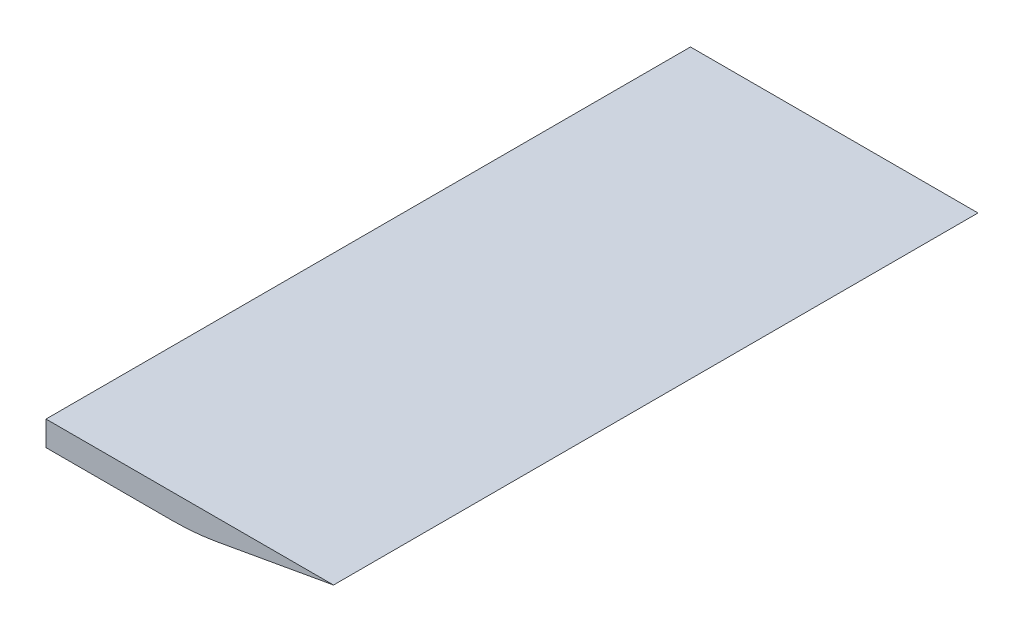
ISO-10303-21;
HEADER;
FILE_DESCRIPTION(('STEP AP214'),'2;1');
FILE_NAME('part.step','',(''),(''),'','','');
FILE_SCHEMA(('AUTOMOTIVE_DESIGN { 1 0 10303 214 1 1 1 1 }'));
ENDSEC;
DATA;
#1=APPLICATION_CONTEXT('core data for automotive mechanical design processes');
#2=APPLICATION_PROTOCOL_DEFINITION('international standard','automotive_design',2000,#1);
#3=PRODUCT_CONTEXT('',#1,'mechanical');
#4=PRODUCT('Part','Part','',(#3));
#5=PRODUCT_RELATED_PRODUCT_CATEGORY('part','',(#4));
#6=PRODUCT_DEFINITION_FORMATION('','',#4);
#7=PRODUCT_DEFINITION_CONTEXT('part definition',#1,'design');
#8=PRODUCT_DEFINITION('design','',#6,#7);
#9=PRODUCT_DEFINITION_SHAPE('','',#8);
#10=(LENGTH_UNIT() NAMED_UNIT(*) SI_UNIT(.MILLI.,.METRE.));
#11=(NAMED_UNIT(*) PLANE_ANGLE_UNIT() SI_UNIT($,.RADIAN.));
#12=(NAMED_UNIT(*) SI_UNIT($,.STERADIAN.) SOLID_ANGLE_UNIT());
#13=UNCERTAINTY_MEASURE_WITH_UNIT(LENGTH_MEASURE(1.E-05),#10,'distance_accuracy_value','');
#14=(GEOMETRIC_REPRESENTATION_CONTEXT(3) GLOBAL_UNCERTAINTY_ASSIGNED_CONTEXT((#13)) GLOBAL_UNIT_ASSIGNED_CONTEXT((#10,
#11,#12)) REPRESENTATION_CONTEXT('',''));
#15=CARTESIAN_POINT('',(0.,0.,0.));
#16=DIRECTION('',(0.,0.,1.));
#17=DIRECTION('',(1.,0.,0.));
#18=AXIS2_PLACEMENT_3D('',#15,#16,#17);
#19=CARTESIAN_POINT('',(0.,-5.,130.));
#20=DIRECTION('',(1.,0.,0.));
#21=DIRECTION('',(0.,0.,-1.));
#22=AXIS2_PLACEMENT_3D('',#19,#20,#21);
#23=PLANE('',#22);
#24=DIRECTION('',(0.,-1.,0.));
#25=VECTOR('',#24,1.);
#26=CARTESIAN_POINT('',(0.,-5.,0.));
#27=LINE('',#26,#25);
#28=CARTESIAN_POINT('',(0.,0.,0.));
#29=VERTEX_POINT('',#28);
#30=CARTESIAN_POINT('',(0.,-5.,0.));
#31=VERTEX_POINT('',#30);
#32=EDGE_CURVE('E103',#29,#31,#27,.T.);
#33=ORIENTED_EDGE('',*,*,#32,.T.);
#34=DIRECTION('',(0.,0.,-1.));
#35=VECTOR('',#34,1.);
#36=CARTESIAN_POINT('',(0.,-5.,130.));
#37=LINE('',#36,#35);
#38=CARTESIAN_POINT('',(0.,-5.,130.));
#39=VERTEX_POINT('',#38);
#40=EDGE_CURVE('E86',#39,#31,#37,.T.);
#41=ORIENTED_EDGE('',*,*,#40,.F.);
#42=DIRECTION('',(0.,-1.,0.));
#43=VECTOR('',#42,1.);
#44=CARTESIAN_POINT('',(0.,-5.,130.));
#45=LINE('',#44,#43);
#46=CARTESIAN_POINT('',(0.,0.,130.));
#47=VERTEX_POINT('',#46);
#48=EDGE_CURVE('E91',#47,#39,#45,.T.);
#49=ORIENTED_EDGE('',*,*,#48,.F.);
#50=DIRECTION('',(0.,0.,-1.));
#51=VECTOR('',#50,1.);
#52=CARTESIAN_POINT('',(0.,0.,130.));
#53=LINE('',#52,#51);
#54=EDGE_CURVE('E110',#47,#29,#53,.T.);
#55=ORIENTED_EDGE('',*,*,#54,.T.);
#56=EDGE_LOOP('',(#33,#41,#49,#55));
#57=FACE_BOUND('',#56,.T.);
#58=ADVANCED_FACE('F39',(#57),#23,.F.);
#59=CARTESIAN_POINT('',(30.,-5.,130.));
#60=DIRECTION('',(0.,1.,0.));
#61=DIRECTION('',(-1.,0.,0.));
#62=AXIS2_PLACEMENT_3D('',#59,#60,#61);
#63=PLANE('',#62);
#64=DIRECTION('',(1.,0.,0.));
#65=VECTOR('',#64,1.);
#66=CARTESIAN_POINT('',(30.,-5.,0.));
#67=LINE('',#66,#65);
#68=CARTESIAN_POINT('',(25.5707469334422,-5.,0.));
#69=VERTEX_POINT('',#68);
#70=EDGE_CURVE('E118',#31,#69,#67,.T.);
#71=ORIENTED_EDGE('',*,*,#70,.T.);
#72=DIRECTION('',(0.,0.,-1.));
#73=VECTOR('',#72,1.);
#74=CARTESIAN_POINT('',(25.5707469334422,-5.,130.));
#75=LINE('',#74,#73);
#76=CARTESIAN_POINT('',(25.5707469334422,-5.,130.));
#77=VERTEX_POINT('',#76);
#78=EDGE_CURVE('E47',#69,#77,#75,.F.);
#79=ORIENTED_EDGE('',*,*,#78,.T.);
#80=DIRECTION('',(1.,0.,0.));
#81=VECTOR('',#80,1.);
#82=CARTESIAN_POINT('',(30.,-5.,130.));
#83=LINE('',#82,#81);
#84=EDGE_CURVE('E82',#39,#77,#83,.T.);
#85=ORIENTED_EDGE('',*,*,#84,.F.);
#86=ORIENTED_EDGE('',*,*,#40,.T.);
#87=EDGE_LOOP('',(#71,#79,#85,#86));
#88=FACE_BOUND('',#87,.T.);
#89=ADVANCED_FACE('F84',(#88),#63,.F.);
#90=CARTESIAN_POINT('',(58.,0.,130.));
#91=DIRECTION('',(-0.175790638483658,0.984427575508482,0.));
#92=DIRECTION('',(-0.984427575508482,-0.175790638483658,0.));
#93=AXIS2_PLACEMENT_3D('',#90,#91,#92);
#94=PLANE('',#93);
#95=DIRECTION('',(0.984427575508482,0.175790638483658,0.));
#96=VECTOR('',#95,1.);
#97=CARTESIAN_POINT('',(58.,0.,130.));
#98=LINE('',#97,#96);
#99=CARTESIAN_POINT('',(34.3602788576251,-4.22137877542409,130.));
#100=VERTEX_POINT('',#99);
#101=CARTESIAN_POINT('',(58.,0.,130.));
#102=VERTEX_POINT('',#101);
#103=EDGE_CURVE('E90',#100,#102,#98,.T.);
#104=ORIENTED_EDGE('',*,*,#103,.F.);
#105=DIRECTION('',(0.,0.,-1.));
#106=VECTOR('',#105,1.);
#107=CARTESIAN_POINT('',(34.3602788576251,-4.22137877542409,130.));
#108=LINE('',#107,#106);
#109=CARTESIAN_POINT('',(34.3602788576251,-4.22137877542409,0.));
#110=VERTEX_POINT('',#109);
#111=EDGE_CURVE('E104',#100,#110,#108,.T.);
#112=ORIENTED_EDGE('',*,*,#111,.T.);
#113=DIRECTION('',(0.984427575508482,0.175790638483658,0.));
#114=VECTOR('',#113,1.);
#115=CARTESIAN_POINT('',(58.,0.,0.));
#116=LINE('',#115,#114);
#117=CARTESIAN_POINT('',(58.,0.,0.));
#118=VERTEX_POINT('',#117);
#119=EDGE_CURVE('E116',#110,#118,#116,.T.);
#120=ORIENTED_EDGE('',*,*,#119,.T.);
#121=DIRECTION('',(0.,0.,-1.));
#122=VECTOR('',#121,1.);
#123=CARTESIAN_POINT('',(58.,0.,130.));
#124=LINE('',#123,#122);
#125=EDGE_CURVE('E105',#102,#118,#124,.T.);
#126=ORIENTED_EDGE('',*,*,#125,.F.);
#127=EDGE_LOOP('',(#104,#112,#120,#126));
#128=FACE_BOUND('',#127,.T.);
#129=ADVANCED_FACE('F126',(#128),#94,.F.);
#130=CARTESIAN_POINT('',(0.,0.,130.));
#131=DIRECTION('',(0.,-1.,0.));
#132=DIRECTION('',(0.,0.,-1.));
#133=AXIS2_PLACEMENT_3D('',#130,#131,#132);
#134=PLANE('',#133);
#135=DIRECTION('',(-1.,0.,0.));
#136=VECTOR('',#135,1.);
#137=CARTESIAN_POINT('',(0.,0.,0.));
#138=LINE('',#137,#136);
#139=EDGE_CURVE('E100',#118,#29,#138,.T.);
#140=ORIENTED_EDGE('',*,*,#139,.T.);
#141=ORIENTED_EDGE('',*,*,#54,.F.);
#142=DIRECTION('',(-1.,0.,0.));
#143=VECTOR('',#142,1.);
#144=CARTESIAN_POINT('',(0.,0.,130.));
#145=LINE('',#144,#143);
#146=EDGE_CURVE('E96',#102,#47,#145,.T.);
#147=ORIENTED_EDGE('',*,*,#146,.F.);
#148=ORIENTED_EDGE('',*,*,#125,.T.);
#149=EDGE_LOOP('',(#140,#141,#147,#148));
#150=FACE_BOUND('',#149,.T.);
#151=ADVANCED_FACE('F129',(#150),#134,.F.);
#152=CARTESIAN_POINT('',(0.,0.,130.));
#153=DIRECTION('',(0.,0.,-1.));
#154=DIRECTION('',(-1.,0.,0.));
#155=AXIS2_PLACEMENT_3D('',#152,#153,#154);
#156=PLANE('',#155);
#157=ORIENTED_EDGE('',*,*,#84,.T.);
#158=CARTESIAN_POINT('',(25.5707469334422,45.,130.));
#159=DIRECTION('',(0.,0.,-1.));
#160=DIRECTION('',(-1.,0.,0.));
#161=AXIS2_PLACEMENT_3D('',#158,#159,#160);
#162=CIRCLE('',#161,50.);
#163=EDGE_CURVE('E11',#77,#100,#162,.F.);
#164=ORIENTED_EDGE('',*,*,#163,.T.);
#165=ORIENTED_EDGE('',*,*,#103,.T.);
#166=ORIENTED_EDGE('',*,*,#146,.T.);
#167=ORIENTED_EDGE('',*,*,#48,.T.);
#168=EDGE_LOOP('',(#157,#164,#165,#166,#167));
#169=FACE_BOUND('',#168,.T.);
#170=ADVANCED_FACE('F94',(#169),#156,.F.);
#171=CARTESIAN_POINT('',(0.,0.,0.));
#172=DIRECTION('',(0.,0.,-1.));
#173=DIRECTION('',(-1.,0.,0.));
#174=AXIS2_PLACEMENT_3D('',#171,#172,#173);
#175=PLANE('',#174);
#176=ORIENTED_EDGE('',*,*,#119,.F.);
#177=CARTESIAN_POINT('',(25.5707469334422,45.,0.));
#178=DIRECTION('',(0.,0.,-1.));
#179=DIRECTION('',(-1.,0.,0.));
#180=AXIS2_PLACEMENT_3D('',#177,#178,#179);
#181=CIRCLE('',#180,50.);
#182=EDGE_CURVE('E61',#110,#69,#181,.T.);
#183=ORIENTED_EDGE('',*,*,#182,.T.);
#184=ORIENTED_EDGE('',*,*,#70,.F.);
#185=ORIENTED_EDGE('',*,*,#32,.F.);
#186=ORIENTED_EDGE('',*,*,#139,.F.);
#187=EDGE_LOOP('',(#176,#183,#184,#185,#186));
#188=FACE_BOUND('',#187,.T.);
#189=ADVANCED_FACE('F130',(#188),#175,.T.);
#190=CARTESIAN_POINT('',(25.5707469334422,45.,130.));
#191=DIRECTION('',(0.,0.,-1.));
#192=DIRECTION('',(-1.,0.,0.));
#193=AXIS2_PLACEMENT_3D('',#190,#191,#192);
#194=CYLINDRICAL_SURFACE('',#193,50.);
#195=ORIENTED_EDGE('',*,*,#163,.F.);
#196=ORIENTED_EDGE('',*,*,#78,.F.);
#197=ORIENTED_EDGE('',*,*,#182,.F.);
#198=ORIENTED_EDGE('',*,*,#111,.F.);
#199=EDGE_LOOP('',(#195,#196,#197,#198));
#200=FACE_BOUND('',#199,.T.);
#201=ADVANCED_FACE('F41',(#200),#194,.T.);
#202=CLOSED_SHELL('',(#58,#89,#129,#151,#170,#189,#201));
#203=MANIFOLD_SOLID_BREP('B2',#202);
#204=ADVANCED_BREP_SHAPE_REPRESENTATION('',(#18,#203),#14);
#205=SHAPE_DEFINITION_REPRESENTATION(#9,#204);
ENDSEC;
END-ISO-10303-21;
